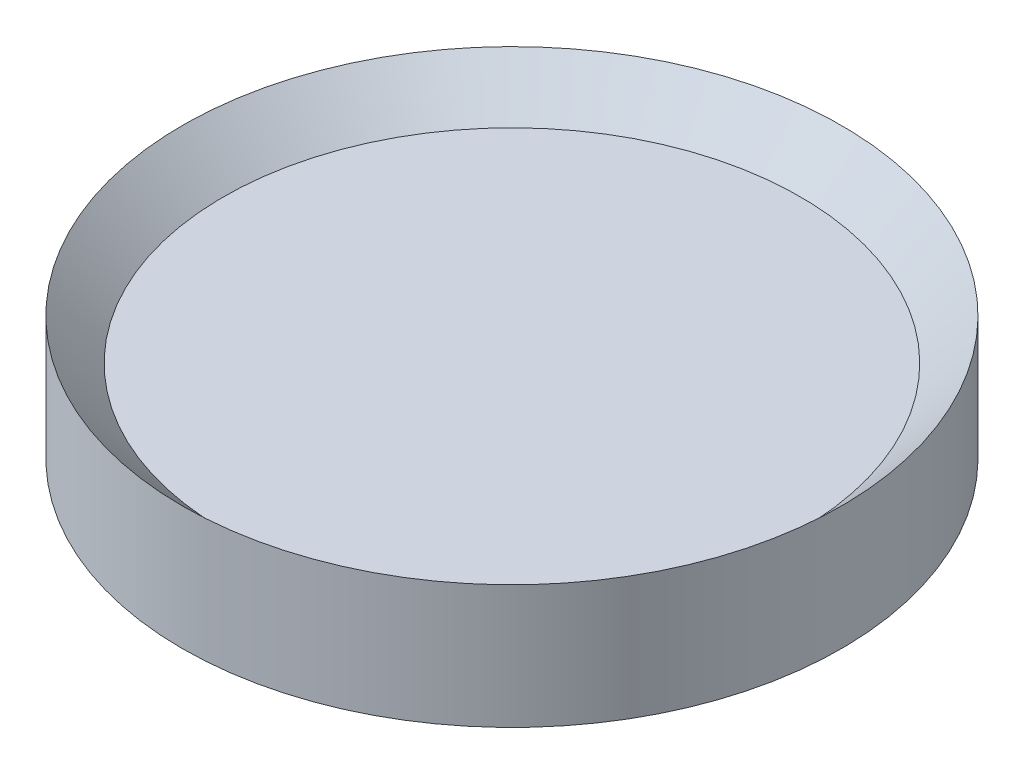
ISO-10303-21;
HEADER;
FILE_DESCRIPTION(('STEP AP214'),'2;1');
FILE_NAME('part.step','',(''),(''),'','','');
FILE_SCHEMA(('AUTOMOTIVE_DESIGN { 1 0 10303 214 1 1 1 1 }'));
ENDSEC;
DATA;
#1=APPLICATION_CONTEXT('core data for automotive mechanical design processes');
#2=APPLICATION_PROTOCOL_DEFINITION('international standard','automotive_design',2000,#1);
#3=PRODUCT_CONTEXT('',#1,'mechanical');
#4=PRODUCT('Part','Part','',(#3));
#5=PRODUCT_RELATED_PRODUCT_CATEGORY('part','',(#4));
#6=PRODUCT_DEFINITION_FORMATION('','',#4);
#7=PRODUCT_DEFINITION_CONTEXT('part definition',#1,'design');
#8=PRODUCT_DEFINITION('design','',#6,#7);
#9=PRODUCT_DEFINITION_SHAPE('','',#8);
#10=(LENGTH_UNIT() NAMED_UNIT(*) SI_UNIT(.MILLI.,.METRE.));
#11=(NAMED_UNIT(*) PLANE_ANGLE_UNIT() SI_UNIT($,.RADIAN.));
#12=(NAMED_UNIT(*) SI_UNIT($,.STERADIAN.) SOLID_ANGLE_UNIT());
#13=UNCERTAINTY_MEASURE_WITH_UNIT(LENGTH_MEASURE(1.E-05),#10,'distance_accuracy_value','');
#14=(GEOMETRIC_REPRESENTATION_CONTEXT(3) GLOBAL_UNCERTAINTY_ASSIGNED_CONTEXT((#13)) GLOBAL_UNIT_ASSIGNED_CONTEXT((#10,
#11,#12)) REPRESENTATION_CONTEXT('',''));
#15=CARTESIAN_POINT('',(0.,0.,0.));
#16=DIRECTION('',(0.,0.,1.));
#17=DIRECTION('',(1.,0.,0.));
#18=AXIS2_PLACEMENT_3D('',#15,#16,#17);
#19=CARTESIAN_POINT('',(0.,-109.55,-16.7));
#20=DIRECTION('',(0.,-1.,0.));
#21=DIRECTION('',(0.,0.,-1.));
#22=AXIS2_PLACEMENT_3D('',#19,#20,#21);
#23=PLANE('',#22);
#24=CARTESIAN_POINT('',(0.,-109.550000003349,-18.7));
#25=DIRECTION('',(0.,1.,0.));
#26=DIRECTION('',(0.,0.,1.));
#27=AXIS2_PLACEMENT_3D('',#24,#25,#26);
#28=CIRCLE('',#27,3.50000000334936);
#29=CARTESIAN_POINT('',(0.,-109.550000003349,-15.1999999966506));
#30=VERTEX_POINT('',#29);
#31=EDGE_CURVE('E20',#30,#30,#28,.T.);
#32=ORIENTED_EDGE('',*,*,#31,.T.);
#33=EDGE_LOOP('',(#32));
#34=FACE_BOUND('',#33,.T.);
#35=ADVANCED_FACE('F16',(#34),#23,.F.);
#36=CARTESIAN_POINT('',(0.,-109.550000003349,-18.7));
#37=DIRECTION('',(0.,1.,0.));
#38=DIRECTION('',(0.,0.,1.));
#39=AXIS2_PLACEMENT_3D('',#36,#37,#38);
#40=CONICAL_SURFACE('',#39,3.50000000334936,0.785398150000005);
#41=CARTESIAN_POINT('',(0.,-109.05,-18.7));
#42=DIRECTION('',(0.,1.,0.));
#43=DIRECTION('',(0.,0.,1.));
#44=AXIS2_PLACEMENT_3D('',#41,#42,#43);
#45=CIRCLE('',#44,4.);
#46=CARTESIAN_POINT('',(0.,-109.05,-14.7));
#47=VERTEX_POINT('',#46);
#48=EDGE_CURVE('E24',#47,#47,#45,.T.);
#49=ORIENTED_EDGE('',*,*,#48,.T.);
#50=EDGE_LOOP('',(#49));
#51=FACE_BOUND('',#50,.T.);
#52=ORIENTED_EDGE('',*,*,#31,.F.);
#53=EDGE_LOOP('',(#52));
#54=FACE_BOUND('',#53,.T.);
#55=ADVANCED_FACE('F35',(#51,#54),#40,.F.);
#56=CARTESIAN_POINT('',(0.,-110.55,-18.7));
#57=DIRECTION('',(0.,1.,0.));
#58=DIRECTION('',(0.,0.,1.));
#59=AXIS2_PLACEMENT_3D('',#56,#57,#58);
#60=CYLINDRICAL_SURFACE('',#59,4.);
#61=ORIENTED_EDGE('',*,*,#48,.F.);
#62=EDGE_LOOP('',(#61));
#63=FACE_BOUND('',#62,.T.);
#64=CARTESIAN_POINT('',(0.,-110.55,-18.7));
#65=DIRECTION('',(0.,1.,0.));
#66=DIRECTION('',(0.,0.,1.));
#67=AXIS2_PLACEMENT_3D('',#64,#65,#66);
#68=CIRCLE('',#67,4.);
#69=CARTESIAN_POINT('',(0.,-110.55,-14.7));
#70=VERTEX_POINT('',#69);
#71=EDGE_CURVE('E11',#70,#70,#68,.T.);
#72=ORIENTED_EDGE('',*,*,#71,.T.);
#73=EDGE_LOOP('',(#72));
#74=FACE_BOUND('',#73,.T.);
#75=ADVANCED_FACE('F29',(#63,#74),#60,.T.);
#76=CARTESIAN_POINT('',(0.,-112.95344247611,-18.7));
#77=DIRECTION('',(0.,1.,0.));
#78=DIRECTION('',(0.,0.,1.));
#79=AXIS2_PLACEMENT_3D('',#76,#77,#78);
#80=CONICAL_SURFACE('',#79,0.,1.0297442586767);
#81=ORIENTED_EDGE('',*,*,#71,.F.);
#82=EDGE_LOOP('',(#81));
#83=FACE_BOUND('',#82,.T.);
#84=CARTESIAN_POINT('',(0.,-112.95344247611,-18.7));
#85=VERTEX_POINT('',#84);
#86=VERTEX_LOOP('',#85);
#87=FACE_BOUND('',#86,.T.);
#88=ADVANCED_FACE('F18',(#83,#87),#80,.T.);
#89=CLOSED_SHELL('',(#35,#55,#75,#88));
#90=MANIFOLD_SOLID_BREP('B1',#89);
#91=ADVANCED_BREP_SHAPE_REPRESENTATION('',(#18,#90),#14);
#92=SHAPE_DEFINITION_REPRESENTATION(#9,#91);
ENDSEC;
END-ISO-10303-21;
